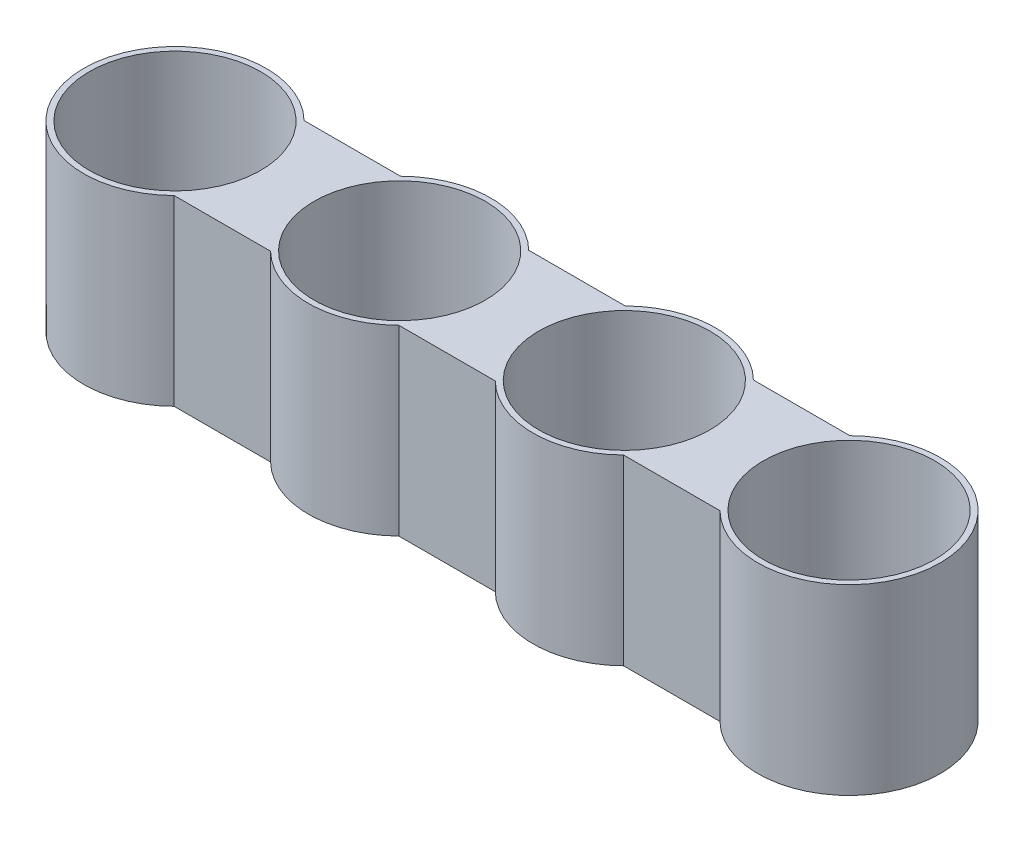
ISO-10303-21;
HEADER;
FILE_DESCRIPTION(('STEP AP214'),'2;1');
FILE_NAME('part.step','',(''),(''),'','','');
FILE_SCHEMA(('AUTOMOTIVE_DESIGN { 1 0 10303 214 1 1 1 1 }'));
ENDSEC;
DATA;
#1=APPLICATION_CONTEXT('core data for automotive mechanical design processes');
#2=APPLICATION_PROTOCOL_DEFINITION('international standard','automotive_design',2000,#1);
#3=PRODUCT_CONTEXT('',#1,'mechanical');
#4=PRODUCT('Part','Part','',(#3));
#5=PRODUCT_RELATED_PRODUCT_CATEGORY('part','',(#4));
#6=PRODUCT_DEFINITION_FORMATION('','',#4);
#7=PRODUCT_DEFINITION_CONTEXT('part definition',#1,'design');
#8=PRODUCT_DEFINITION('design','',#6,#7);
#9=PRODUCT_DEFINITION_SHAPE('','',#8);
#10=(LENGTH_UNIT() NAMED_UNIT(*) SI_UNIT(.MILLI.,.METRE.));
#11=(NAMED_UNIT(*) PLANE_ANGLE_UNIT() SI_UNIT($,.RADIAN.));
#12=(NAMED_UNIT(*) SI_UNIT($,.STERADIAN.) SOLID_ANGLE_UNIT());
#13=UNCERTAINTY_MEASURE_WITH_UNIT(LENGTH_MEASURE(1.E-05),#10,'distance_accuracy_value','');
#14=(GEOMETRIC_REPRESENTATION_CONTEXT(3) GLOBAL_UNCERTAINTY_ASSIGNED_CONTEXT((#13)) GLOBAL_UNIT_ASSIGNED_CONTEXT((#10,
#11,#12)) REPRESENTATION_CONTEXT('',''));
#15=CARTESIAN_POINT('',(0.,0.,0.));
#16=DIRECTION('',(0.,0.,1.));
#17=DIRECTION('',(1.,0.,0.));
#18=AXIS2_PLACEMENT_3D('',#15,#16,#17);
#19=CARTESIAN_POINT('',(40.,10.,5.58637014214901E-13));
#20=DIRECTION('',(0.,1.,0.));
#21=DIRECTION('',(0.,0.,1.));
#22=AXIS2_PLACEMENT_3D('',#19,#20,#21);
#23=PLANE('',#22);
#24=CARTESIAN_POINT('',(40.,10.,5.58637014214901E-13));
#25=DIRECTION('',(0.,-1.,0.));
#26=DIRECTION('',(0.,0.,-1.));
#27=AXIS2_PLACEMENT_3D('',#24,#25,#26);
#28=CIRCLE('',#27,30.5);
#29=CARTESIAN_POINT('',(40.,10.,-30.4999999999994));
#30=VERTEX_POINT('',#29);
#31=EDGE_CURVE('E20',#30,#30,#28,.F.);
#32=ORIENTED_EDGE('',*,*,#31,.T.);
#33=EDGE_LOOP('',(#32));
#34=FACE_BOUND('',#33,.T.);
#35=ADVANCED_FACE('F17',(#34),#23,.T.);
#36=CARTESIAN_POINT('',(-120.,10.,5.58637014214901E-13));
#37=DIRECTION('',(0.,1.,0.));
#38=DIRECTION('',(0.,0.,1.));
#39=AXIS2_PLACEMENT_3D('',#36,#37,#38);
#40=PLANE('',#39);
#41=CARTESIAN_POINT('',(-120.,10.,5.58637014214901E-13));
#42=DIRECTION('',(0.,-1.,0.));
#43=DIRECTION('',(0.,0.,-1.));
#44=AXIS2_PLACEMENT_3D('',#41,#42,#43);
#45=CIRCLE('',#44,30.5);
#46=CARTESIAN_POINT('',(-120.,10.,-30.4999999999994));
#47=VERTEX_POINT('',#46);
#48=EDGE_CURVE('E196',#47,#47,#45,.F.);
#49=ORIENTED_EDGE('',*,*,#48,.T.);
#50=EDGE_LOOP('',(#49));
#51=FACE_BOUND('',#50,.T.);
#52=ADVANCED_FACE('F402',(#51),#40,.T.);
#53=CARTESIAN_POINT('',(-40.,10.,5.58637014214901E-13));
#54=DIRECTION('',(0.,1.,0.));
#55=DIRECTION('',(0.,0.,1.));
#56=AXIS2_PLACEMENT_3D('',#53,#54,#55);
#57=PLANE('',#56);
#58=CARTESIAN_POINT('',(-40.,10.,5.58637014214901E-13));
#59=DIRECTION('',(0.,-1.,0.));
#60=DIRECTION('',(0.,0.,-1.));
#61=AXIS2_PLACEMENT_3D('',#58,#59,#60);
#62=CIRCLE('',#61,30.5);
#63=CARTESIAN_POINT('',(-40.,10.,-30.4999999999994));
#64=VERTEX_POINT('',#63);
#65=EDGE_CURVE('E194',#64,#64,#62,.F.);
#66=ORIENTED_EDGE('',*,*,#65,.T.);
#67=EDGE_LOOP('',(#66));
#68=FACE_BOUND('',#67,.T.);
#69=ADVANCED_FACE('F393',(#68),#57,.T.);
#70=CARTESIAN_POINT('',(120.,10.,5.58637014214901E-13));
#71=DIRECTION('',(0.,1.,0.));
#72=DIRECTION('',(0.,0.,1.));
#73=AXIS2_PLACEMENT_3D('',#70,#71,#72);
#74=PLANE('',#73);
#75=CARTESIAN_POINT('',(120.,10.,5.58637014214901E-13));
#76=DIRECTION('',(0.,-1.,0.));
#77=DIRECTION('',(0.,0.,-1.));
#78=AXIS2_PLACEMENT_3D('',#75,#76,#77);
#79=CIRCLE('',#78,30.5);
#80=CARTESIAN_POINT('',(120.,10.,-30.4999999999994));
#81=VERTEX_POINT('',#80);
#82=EDGE_CURVE('E191',#81,#81,#79,.F.);
#83=ORIENTED_EDGE('',*,*,#82,.T.);
#84=EDGE_LOOP('',(#83));
#85=FACE_BOUND('',#84,.T.);
#86=ADVANCED_FACE('F208',(#85),#74,.T.);
#87=CARTESIAN_POINT('',(40.,72.,5.58637014214901E-13));
#88=DIRECTION('',(0.,-1.,0.));
#89=DIRECTION('',(0.,0.,-1.));
#90=AXIS2_PLACEMENT_3D('',#87,#88,#89);
#91=CYLINDRICAL_SURFACE('',#90,30.5);
#92=ORIENTED_EDGE('',*,*,#31,.F.);
#93=EDGE_LOOP('',(#92));
#94=FACE_BOUND('',#93,.T.);
#95=CARTESIAN_POINT('',(40.,65.,5.58637014214901E-13));
#96=DIRECTION('',(0.,-1.,0.));
#97=DIRECTION('',(0.,0.,-1.));
#98=AXIS2_PLACEMENT_3D('',#95,#96,#97);
#99=CIRCLE('',#98,30.5);
#100=CARTESIAN_POINT('',(40.,65.,-30.4999999999994));
#101=VERTEX_POINT('',#100);
#102=EDGE_CURVE('E188',#101,#101,#99,.T.);
#103=ORIENTED_EDGE('',*,*,#102,.F.);
#104=EDGE_LOOP('',(#103));
#105=FACE_BOUND('',#104,.T.);
#106=ADVANCED_FACE('F204',(#94,#105),#91,.F.);
#107=CARTESIAN_POINT('',(-120.,72.,5.58637014214901E-13));
#108=DIRECTION('',(0.,-1.,0.));
#109=DIRECTION('',(0.,0.,-1.));
#110=AXIS2_PLACEMENT_3D('',#107,#108,#109);
#111=CYLINDRICAL_SURFACE('',#110,30.5);
#112=ORIENTED_EDGE('',*,*,#48,.F.);
#113=EDGE_LOOP('',(#112));
#114=FACE_BOUND('',#113,.T.);
#115=CARTESIAN_POINT('',(-120.,65.,5.58637014214901E-13));
#116=DIRECTION('',(0.,-1.,0.));
#117=DIRECTION('',(0.,0.,-1.));
#118=AXIS2_PLACEMENT_3D('',#115,#116,#117);
#119=CIRCLE('',#118,30.5);
#120=CARTESIAN_POINT('',(-120.,65.,-30.4999999999994));
#121=VERTEX_POINT('',#120);
#122=EDGE_CURVE('E185',#121,#121,#119,.T.);
#123=ORIENTED_EDGE('',*,*,#122,.F.);
#124=EDGE_LOOP('',(#123));
#125=FACE_BOUND('',#124,.T.);
#126=ADVANCED_FACE('F207',(#114,#125),#111,.F.);
#127=CARTESIAN_POINT('',(-40.,72.,5.58637014214901E-13));
#128=DIRECTION('',(0.,-1.,0.));
#129=DIRECTION('',(0.,0.,-1.));
#130=AXIS2_PLACEMENT_3D('',#127,#128,#129);
#131=CYLINDRICAL_SURFACE('',#130,30.5);
#132=ORIENTED_EDGE('',*,*,#65,.F.);
#133=EDGE_LOOP('',(#132));
#134=FACE_BOUND('',#133,.T.);
#135=CARTESIAN_POINT('',(-40.,65.,5.58637014214901E-13));
#136=DIRECTION('',(0.,-1.,0.));
#137=DIRECTION('',(0.,0.,-1.));
#138=AXIS2_PLACEMENT_3D('',#135,#136,#137);
#139=CIRCLE('',#138,30.5);
#140=CARTESIAN_POINT('',(-40.,65.,-30.4999999999994));
#141=VERTEX_POINT('',#140);
#142=EDGE_CURVE('E182',#141,#141,#139,.T.);
#143=ORIENTED_EDGE('',*,*,#142,.F.);
#144=EDGE_LOOP('',(#143));
#145=FACE_BOUND('',#144,.T.);
#146=ADVANCED_FACE('F222',(#134,#145),#131,.F.);
#147=CARTESIAN_POINT('',(120.,72.,5.58637014214901E-13));
#148=DIRECTION('',(0.,-1.,0.));
#149=DIRECTION('',(0.,0.,-1.));
#150=AXIS2_PLACEMENT_3D('',#147,#148,#149);
#151=CYLINDRICAL_SURFACE('',#150,30.5);
#152=ORIENTED_EDGE('',*,*,#82,.F.);
#153=EDGE_LOOP('',(#152));
#154=FACE_BOUND('',#153,.T.);
#155=CARTESIAN_POINT('',(120.,65.,5.58637014214901E-13));
#156=DIRECTION('',(0.,-1.,0.));
#157=DIRECTION('',(0.,0.,-1.));
#158=AXIS2_PLACEMENT_3D('',#155,#156,#157);
#159=CIRCLE('',#158,30.5);
#160=CARTESIAN_POINT('',(120.,65.,-30.4999999999994));
#161=VERTEX_POINT('',#160);
#162=EDGE_CURVE('E124',#161,#161,#159,.T.);
#163=ORIENTED_EDGE('',*,*,#162,.F.);
#164=EDGE_LOOP('',(#163));
#165=FACE_BOUND('',#164,.T.);
#166=ADVANCED_FACE('F213',(#154,#165),#151,.F.);
#167=CARTESIAN_POINT('',(0.,65.,0.));
#168=DIRECTION('',(0.,1.,0.));
#169=DIRECTION('',(0.,0.,1.));
#170=AXIS2_PLACEMENT_3D('',#167,#168,#169);
#171=PLANE('',#170);
#172=ORIENTED_EDGE('',*,*,#162,.T.);
#173=EDGE_LOOP('',(#172));
#174=FACE_BOUND('',#173,.T.);
#175=ORIENTED_EDGE('',*,*,#142,.T.);
#176=EDGE_LOOP('',(#175));
#177=FACE_BOUND('',#176,.T.);
#178=DIRECTION('',(1.,0.,0.));
#179=VECTOR('',#178,1.);
#180=CARTESIAN_POINT('',(0.,65.,-23.1276338785142));
#181=LINE('',#180,#179);
#182=CARTESIAN_POINT('',(17.1666351323025,65.,-23.1276338785142));
#183=VERTEX_POINT('',#182);
#184=CARTESIAN_POINT('',(-17.1666351323025,65.,-23.1276338785142));
#185=VERTEX_POINT('',#184);
#186=EDGE_CURVE('E143',#183,#185,#181,.F.);
#187=ORIENTED_EDGE('',*,*,#186,.T.);
#188=CARTESIAN_POINT('',(-40.,65.,0.));
#189=DIRECTION('',(0.,-1.,0.));
#190=DIRECTION('',(0.,0.,-1.));
#191=AXIS2_PLACEMENT_3D('',#188,#189,#190);
#192=CIRCLE('',#191,32.5);
#193=CARTESIAN_POINT('',(-62.8333648676975,65.,-23.1276338785142));
#194=VERTEX_POINT('',#193);
#195=EDGE_CURVE('E173',#194,#185,#192,.T.);
#196=ORIENTED_EDGE('',*,*,#195,.F.);
#197=DIRECTION('',(1.,0.,0.));
#198=VECTOR('',#197,1.);
#199=CARTESIAN_POINT('',(0.,65.,-23.1276338785142));
#200=LINE('',#199,#198);
#201=CARTESIAN_POINT('',(-97.1666351323031,65.,-23.1276338785142));
#202=VERTEX_POINT('',#201);
#203=EDGE_CURVE('E138',#194,#202,#200,.F.);
#204=ORIENTED_EDGE('',*,*,#203,.T.);
#205=CARTESIAN_POINT('',(-120.,65.,5.58637014214901E-13));
#206=DIRECTION('',(0.,-1.,0.));
#207=DIRECTION('',(0.,0.,-1.));
#208=AXIS2_PLACEMENT_3D('',#205,#206,#207);
#209=CIRCLE('',#208,32.5);
#210=CARTESIAN_POINT('',(-97.1666351323022,65.,23.1276338785144));
#211=VERTEX_POINT('',#210);
#212=EDGE_CURVE('E171',#211,#202,#209,.T.);
#213=ORIENTED_EDGE('',*,*,#212,.F.);
#214=DIRECTION('',(1.,0.,0.));
#215=VECTOR('',#214,1.);
#216=CARTESIAN_POINT('',(0.,65.,23.1276338785143));
#217=LINE('',#216,#215);
#218=CARTESIAN_POINT('',(-62.8333648676973,65.,23.1276338785144));
#219=VERTEX_POINT('',#218);
#220=EDGE_CURVE('E120',#219,#211,#217,.F.);
#221=ORIENTED_EDGE('',*,*,#220,.F.);
#222=CARTESIAN_POINT('',(-40.,65.,0.));
#223=DIRECTION('',(0.,-1.,0.));
#224=DIRECTION('',(0.,0.,-1.));
#225=AXIS2_PLACEMENT_3D('',#222,#223,#224);
#226=CIRCLE('',#225,32.5);
#227=CARTESIAN_POINT('',(-17.1666351323027,65.,23.1276338785144));
#228=VERTEX_POINT('',#227);
#229=EDGE_CURVE('E112',#228,#219,#226,.T.);
#230=ORIENTED_EDGE('',*,*,#229,.F.);
#231=DIRECTION('',(1.,0.,0.));
#232=VECTOR('',#231,1.);
#233=CARTESIAN_POINT('',(0.,65.,23.1276338785144));
#234=LINE('',#233,#232);
#235=CARTESIAN_POINT('',(17.1666351323026,65.,23.1276338785143));
#236=VERTEX_POINT('',#235);
#237=EDGE_CURVE('E102',#236,#228,#234,.F.);
#238=ORIENTED_EDGE('',*,*,#237,.F.);
#239=CARTESIAN_POINT('',(40.,65.,0.));
#240=DIRECTION('',(0.,-1.,0.));
#241=DIRECTION('',(0.,0.,-1.));
#242=AXIS2_PLACEMENT_3D('',#239,#240,#241);
#243=CIRCLE('',#242,32.5);
#244=CARTESIAN_POINT('',(62.8333648676974,65.,23.1276338785143));
#245=VERTEX_POINT('',#244);
#246=EDGE_CURVE('E129',#245,#236,#243,.T.);
#247=ORIENTED_EDGE('',*,*,#246,.F.);
#248=DIRECTION('',(1.,0.,0.));
#249=VECTOR('',#248,1.);
#250=CARTESIAN_POINT('',(0.,65.,23.1276338785144));
#251=LINE('',#250,#249);
#252=CARTESIAN_POINT('',(97.166635132302,65.,23.1276338785143));
#253=VERTEX_POINT('',#252);
#254=EDGE_CURVE('E152',#253,#245,#251,.F.);
#255=ORIENTED_EDGE('',*,*,#254,.F.);
#256=CARTESIAN_POINT('',(120.,65.,5.58637014214901E-13));
#257=DIRECTION('',(0.,-1.,0.));
#258=DIRECTION('',(0.,0.,-1.));
#259=AXIS2_PLACEMENT_3D('',#256,#257,#258);
#260=CIRCLE('',#259,32.5);
#261=CARTESIAN_POINT('',(97.1666351323031,65.,-23.1276338785142));
#262=VERTEX_POINT('',#261);
#263=EDGE_CURVE('E177',#262,#253,#260,.T.);
#264=ORIENTED_EDGE('',*,*,#263,.F.);
#265=DIRECTION('',(1.,0.,0.));
#266=VECTOR('',#265,1.);
#267=CARTESIAN_POINT('',(0.,65.,-23.1276338785143));
#268=LINE('',#267,#266);
#269=CARTESIAN_POINT('',(62.8333648676975,65.,-23.1276338785142));
#270=VERTEX_POINT('',#269);
#271=EDGE_CURVE('E147',#262,#270,#268,.F.);
#272=ORIENTED_EDGE('',*,*,#271,.T.);
#273=CARTESIAN_POINT('',(40.,65.,0.));
#274=DIRECTION('',(0.,-1.,0.));
#275=DIRECTION('',(0.,0.,-1.));
#276=AXIS2_PLACEMENT_3D('',#273,#274,#275);
#277=CIRCLE('',#276,32.5);
#278=EDGE_CURVE('E175',#183,#270,#277,.T.);
#279=ORIENTED_EDGE('',*,*,#278,.F.);
#280=EDGE_LOOP('',(#187,#196,#204,#213,#221,#230,#238,#247,#255,#264,#272,#279));
#281=FACE_BOUND('',#280,.T.);
#282=ORIENTED_EDGE('',*,*,#122,.T.);
#283=EDGE_LOOP('',(#282));
#284=FACE_BOUND('',#283,.T.);
#285=ORIENTED_EDGE('',*,*,#102,.T.);
#286=EDGE_LOOP('',(#285));
#287=FACE_BOUND('',#286,.T.);
#288=ADVANCED_FACE('F117',(#174,#177,#281,#284,#287),#171,.T.);
#289=CARTESIAN_POINT('',(-40.,65.,0.));
#290=DIRECTION('',(0.,-1.,0.));
#291=DIRECTION('',(0.,0.,-1.));
#292=AXIS2_PLACEMENT_3D('',#289,#290,#291);
#293=CYLINDRICAL_SURFACE('',#292,32.5);
#294=ORIENTED_EDGE('',*,*,#229,.T.);
#295=DIRECTION('',(0.,1.,0.));
#296=VECTOR('',#295,1.);
#297=CARTESIAN_POINT('',(-62.8333648676973,65.,23.1276338785144));
#298=LINE('',#297,#296);
#299=CARTESIAN_POINT('',(-62.8333648676973,0.,23.1276338785144));
#300=VERTEX_POINT('',#299);
#301=EDGE_CURVE('E137',#300,#219,#298,.T.);
#302=ORIENTED_EDGE('',*,*,#301,.F.);
#303=CARTESIAN_POINT('',(-40.,0.,0.));
#304=DIRECTION('',(0.,-1.,0.));
#305=DIRECTION('',(0.,0.,-1.));
#306=AXIS2_PLACEMENT_3D('',#303,#304,#305);
#307=CIRCLE('',#306,32.5);
#308=CARTESIAN_POINT('',(-17.1666351323027,0.,23.1276338785144));
#309=VERTEX_POINT('',#308);
#310=EDGE_CURVE('E128',#300,#309,#307,.F.);
#311=ORIENTED_EDGE('',*,*,#310,.T.);
#312=DIRECTION('',(0.,1.,0.));
#313=VECTOR('',#312,1.);
#314=CARTESIAN_POINT('',(-17.1666351323027,65.,23.1276338785144));
#315=LINE('',#314,#313);
#316=EDGE_CURVE('E107',#228,#309,#315,.F.);
#317=ORIENTED_EDGE('',*,*,#316,.F.);
#318=EDGE_LOOP('',(#294,#302,#311,#317));
#319=FACE_BOUND('',#318,.T.);
#320=ADVANCED_FACE('F127',(#319),#293,.T.);
#321=CARTESIAN_POINT('',(0.,65.,23.1276338785144));
#322=DIRECTION('',(0.,0.,1.));
#323=DIRECTION('',(1.,0.,0.));
#324=AXIS2_PLACEMENT_3D('',#321,#322,#323);
#325=PLANE('',#324);
#326=ORIENTED_EDGE('',*,*,#237,.T.);
#327=ORIENTED_EDGE('',*,*,#316,.T.);
#328=DIRECTION('',(1.,0.,0.));
#329=VECTOR('',#328,1.);
#330=CARTESIAN_POINT('',(0.,0.,23.1276338785144));
#331=LINE('',#330,#329);
#332=CARTESIAN_POINT('',(17.1666351323027,0.,23.1276338785144));
#333=VERTEX_POINT('',#332);
#334=EDGE_CURVE('E169',#309,#333,#331,.T.);
#335=ORIENTED_EDGE('',*,*,#334,.T.);
#336=DIRECTION('',(0.,-1.,0.));
#337=VECTOR('',#336,1.);
#338=CARTESIAN_POINT('',(17.1666351323026,65.,23.1276338785143));
#339=LINE('',#338,#337);
#340=EDGE_CURVE('E109',#236,#333,#339,.T.);
#341=ORIENTED_EDGE('',*,*,#340,.F.);
#342=EDGE_LOOP('',(#326,#327,#335,#341));
#343=FACE_BOUND('',#342,.T.);
#344=ADVANCED_FACE('F104',(#343),#325,.T.);
#345=CARTESIAN_POINT('',(40.,65.,0.));
#346=DIRECTION('',(0.,-1.,0.));
#347=DIRECTION('',(0.,0.,-1.));
#348=AXIS2_PLACEMENT_3D('',#345,#346,#347);
#349=CYLINDRICAL_SURFACE('',#348,32.5);
#350=ORIENTED_EDGE('',*,*,#246,.T.);
#351=ORIENTED_EDGE('',*,*,#340,.T.);
#352=CARTESIAN_POINT('',(40.,0.,0.));
#353=DIRECTION('',(0.,-1.,0.));
#354=DIRECTION('',(0.,0.,-1.));
#355=AXIS2_PLACEMENT_3D('',#352,#353,#354);
#356=CIRCLE('',#355,32.5);
#357=CARTESIAN_POINT('',(62.8333648676974,0.,23.1276338785143));
#358=VERTEX_POINT('',#357);
#359=EDGE_CURVE('E166',#333,#358,#356,.F.);
#360=ORIENTED_EDGE('',*,*,#359,.T.);
#361=DIRECTION('',(0.,1.,0.));
#362=VECTOR('',#361,1.);
#363=CARTESIAN_POINT('',(62.8333648676974,65.,23.1276338785143));
#364=LINE('',#363,#362);
#365=EDGE_CURVE('E153',#245,#358,#364,.F.);
#366=ORIENTED_EDGE('',*,*,#365,.F.);
#367=EDGE_LOOP('',(#350,#351,#360,#366));
#368=FACE_BOUND('',#367,.T.);
#369=ADVANCED_FACE('F268',(#368),#349,.T.);
#370=CARTESIAN_POINT('',(0.,65.,23.1276338785144));
#371=DIRECTION('',(0.,0.,1.));
#372=DIRECTION('',(1.,0.,0.));
#373=AXIS2_PLACEMENT_3D('',#370,#371,#372);
#374=PLANE('',#373);
#375=ORIENTED_EDGE('',*,*,#254,.T.);
#376=ORIENTED_EDGE('',*,*,#365,.T.);
#377=DIRECTION('',(1.,0.,0.));
#378=VECTOR('',#377,1.);
#379=CARTESIAN_POINT('',(0.,0.,23.1276338785143));
#380=LINE('',#379,#378);
#381=CARTESIAN_POINT('',(97.166635132302,0.,23.1276338785143));
#382=VERTEX_POINT('',#381);
#383=EDGE_CURVE('E165',#358,#382,#380,.T.);
#384=ORIENTED_EDGE('',*,*,#383,.T.);
#385=DIRECTION('',(0.,-1.,0.));
#386=VECTOR('',#385,1.);
#387=CARTESIAN_POINT('',(97.166635132302,65.,23.1276338785143));
#388=LINE('',#387,#386);
#389=EDGE_CURVE('E178',#253,#382,#388,.T.);
#390=ORIENTED_EDGE('',*,*,#389,.F.);
#391=EDGE_LOOP('',(#375,#376,#384,#390));
#392=FACE_BOUND('',#391,.T.);
#393=ADVANCED_FACE('F264',(#392),#374,.T.);
#394=CARTESIAN_POINT('',(120.,65.,5.58637014214901E-13));
#395=DIRECTION('',(0.,-1.,0.));
#396=DIRECTION('',(0.,0.,-1.));
#397=AXIS2_PLACEMENT_3D('',#394,#395,#396);
#398=CYLINDRICAL_SURFACE('',#397,32.5);
#399=CARTESIAN_POINT('',(120.,0.,5.58637014214901E-13));
#400=DIRECTION('',(0.,-1.,0.));
#401=DIRECTION('',(0.,0.,-1.));
#402=AXIS2_PLACEMENT_3D('',#399,#400,#401);
#403=CIRCLE('',#402,32.5);
#404=CARTESIAN_POINT('',(97.1666351323031,0.,-23.1276338785142));
#405=VERTEX_POINT('',#404);
#406=EDGE_CURVE('E163',#382,#405,#403,.F.);
#407=ORIENTED_EDGE('',*,*,#406,.T.);
#408=DIRECTION('',(0.,1.,0.));
#409=VECTOR('',#408,1.);
#410=CARTESIAN_POINT('',(97.1666351323031,65.,-23.1276338785142));
#411=LINE('',#410,#409);
#412=EDGE_CURVE('E151',#405,#262,#411,.T.);
#413=ORIENTED_EDGE('',*,*,#412,.T.);
#414=ORIENTED_EDGE('',*,*,#263,.T.);
#415=ORIENTED_EDGE('',*,*,#389,.T.);
#416=EDGE_LOOP('',(#407,#413,#414,#415));
#417=FACE_BOUND('',#416,.T.);
#418=ADVANCED_FACE('F260',(#417),#398,.T.);
#419=CARTESIAN_POINT('',(0.,65.,-23.1276338785143));
#420=DIRECTION('',(0.,0.,1.));
#421=DIRECTION('',(1.,0.,0.));
#422=AXIS2_PLACEMENT_3D('',#419,#420,#421);
#423=PLANE('',#422);
#424=DIRECTION('',(0.,-1.,0.));
#425=VECTOR('',#424,1.);
#426=CARTESIAN_POINT('',(62.8333648676975,65.,-23.1276338785142));
#427=LINE('',#426,#425);
#428=CARTESIAN_POINT('',(62.8333648676975,0.,-23.1276338785142));
#429=VERTEX_POINT('',#428);
#430=EDGE_CURVE('E150',#270,#429,#427,.T.);
#431=ORIENTED_EDGE('',*,*,#430,.F.);
#432=ORIENTED_EDGE('',*,*,#271,.F.);
#433=ORIENTED_EDGE('',*,*,#412,.F.);
#434=DIRECTION('',(1.,0.,0.));
#435=VECTOR('',#434,1.);
#436=CARTESIAN_POINT('',(0.,0.,-23.1276338785142));
#437=LINE('',#436,#435);
#438=EDGE_CURVE('E162',#405,#429,#437,.F.);
#439=ORIENTED_EDGE('',*,*,#438,.T.);
#440=EDGE_LOOP('',(#431,#432,#433,#439));
#441=FACE_BOUND('',#440,.T.);
#442=ADVANCED_FACE('F256',(#441),#423,.F.);
#443=CARTESIAN_POINT('',(40.,65.,0.));
#444=DIRECTION('',(0.,-1.,0.));
#445=DIRECTION('',(0.,0.,-1.));
#446=AXIS2_PLACEMENT_3D('',#443,#444,#445);
#447=CYLINDRICAL_SURFACE('',#446,32.5);
#448=CARTESIAN_POINT('',(40.,0.,0.));
#449=DIRECTION('',(0.,-1.,0.));
#450=DIRECTION('',(0.,0.,-1.));
#451=AXIS2_PLACEMENT_3D('',#448,#449,#450);
#452=CIRCLE('',#451,32.5);
#453=CARTESIAN_POINT('',(17.1666351323025,0.,-23.1276338785142));
#454=VERTEX_POINT('',#453);
#455=EDGE_CURVE('E160',#429,#454,#452,.F.);
#456=ORIENTED_EDGE('',*,*,#455,.T.);
#457=DIRECTION('',(0.,1.,0.));
#458=VECTOR('',#457,1.);
#459=CARTESIAN_POINT('',(17.1666351323025,65.,-23.1276338785142));
#460=LINE('',#459,#458);
#461=EDGE_CURVE('E146',#454,#183,#460,.T.);
#462=ORIENTED_EDGE('',*,*,#461,.T.);
#463=ORIENTED_EDGE('',*,*,#278,.T.);
#464=ORIENTED_EDGE('',*,*,#430,.T.);
#465=EDGE_LOOP('',(#456,#462,#463,#464));
#466=FACE_BOUND('',#465,.T.);
#467=ADVANCED_FACE('F252',(#466),#447,.T.);
#468=CARTESIAN_POINT('',(0.,65.,-23.1276338785142));
#469=DIRECTION('',(0.,0.,1.));
#470=DIRECTION('',(1.,0.,0.));
#471=AXIS2_PLACEMENT_3D('',#468,#469,#470);
#472=PLANE('',#471);
#473=DIRECTION('',(0.,-1.,0.));
#474=VECTOR('',#473,1.);
#475=CARTESIAN_POINT('',(-17.1666351323025,65.,-23.1276338785142));
#476=LINE('',#475,#474);
#477=CARTESIAN_POINT('',(-17.1666351323025,0.,-23.1276338785142));
#478=VERTEX_POINT('',#477);
#479=EDGE_CURVE('E145',#185,#478,#476,.T.);
#480=ORIENTED_EDGE('',*,*,#479,.F.);
#481=ORIENTED_EDGE('',*,*,#186,.F.);
#482=ORIENTED_EDGE('',*,*,#461,.F.);
#483=DIRECTION('',(1.,0.,0.));
#484=VECTOR('',#483,1.);
#485=CARTESIAN_POINT('',(0.,0.,-23.1276338785142));
#486=LINE('',#485,#484);
#487=EDGE_CURVE('E159',#454,#478,#486,.F.);
#488=ORIENTED_EDGE('',*,*,#487,.T.);
#489=EDGE_LOOP('',(#480,#481,#482,#488));
#490=FACE_BOUND('',#489,.T.);
#491=ADVANCED_FACE('F248',(#490),#472,.F.);
#492=CARTESIAN_POINT('',(-40.,65.,0.));
#493=DIRECTION('',(0.,-1.,0.));
#494=DIRECTION('',(0.,0.,-1.));
#495=AXIS2_PLACEMENT_3D('',#492,#493,#494);
#496=CYLINDRICAL_SURFACE('',#495,32.5);
#497=CARTESIAN_POINT('',(-40.,0.,0.));
#498=DIRECTION('',(0.,-1.,0.));
#499=DIRECTION('',(0.,0.,-1.));
#500=AXIS2_PLACEMENT_3D('',#497,#498,#499);
#501=CIRCLE('',#500,32.5);
#502=CARTESIAN_POINT('',(-62.8333648676975,0.,-23.1276338785142));
#503=VERTEX_POINT('',#502);
#504=EDGE_CURVE('E157',#478,#503,#501,.F.);
#505=ORIENTED_EDGE('',*,*,#504,.T.);
#506=DIRECTION('',(0.,1.,0.));
#507=VECTOR('',#506,1.);
#508=CARTESIAN_POINT('',(-62.8333648676975,65.,-23.1276338785142));
#509=LINE('',#508,#507);
#510=EDGE_CURVE('E142',#503,#194,#509,.T.);
#511=ORIENTED_EDGE('',*,*,#510,.T.);
#512=ORIENTED_EDGE('',*,*,#195,.T.);
#513=ORIENTED_EDGE('',*,*,#479,.T.);
#514=EDGE_LOOP('',(#505,#511,#512,#513));
#515=FACE_BOUND('',#514,.T.);
#516=ADVANCED_FACE('F244',(#515),#496,.T.);
#517=CARTESIAN_POINT('',(0.,65.,-23.1276338785142));
#518=DIRECTION('',(0.,0.,1.));
#519=DIRECTION('',(1.,0.,0.));
#520=AXIS2_PLACEMENT_3D('',#517,#518,#519);
#521=PLANE('',#520);
#522=DIRECTION('',(0.,-1.,0.));
#523=VECTOR('',#522,1.);
#524=CARTESIAN_POINT('',(-97.1666351323031,65.,-23.1276338785142));
#525=LINE('',#524,#523);
#526=CARTESIAN_POINT('',(-97.1666351323031,0.,-23.1276338785142));
#527=VERTEX_POINT('',#526);
#528=EDGE_CURVE('E141',#202,#527,#525,.T.);
#529=ORIENTED_EDGE('',*,*,#528,.F.);
#530=ORIENTED_EDGE('',*,*,#203,.F.);
#531=ORIENTED_EDGE('',*,*,#510,.F.);
#532=DIRECTION('',(1.,0.,0.));
#533=VECTOR('',#532,1.);
#534=CARTESIAN_POINT('',(0.,0.,-23.1276338785142));
#535=LINE('',#534,#533);
#536=EDGE_CURVE('E156',#503,#527,#535,.F.);
#537=ORIENTED_EDGE('',*,*,#536,.T.);
#538=EDGE_LOOP('',(#529,#530,#531,#537));
#539=FACE_BOUND('',#538,.T.);
#540=ADVANCED_FACE('F241',(#539),#521,.F.);
#541=CARTESIAN_POINT('',(-120.,65.,5.58637014214901E-13));
#542=DIRECTION('',(0.,-1.,0.));
#543=DIRECTION('',(0.,0.,-1.));
#544=AXIS2_PLACEMENT_3D('',#541,#542,#543);
#545=CYLINDRICAL_SURFACE('',#544,32.5);
#546=CARTESIAN_POINT('',(-120.,0.,5.58637014214901E-13));
#547=DIRECTION('',(0.,-1.,0.));
#548=DIRECTION('',(0.,0.,-1.));
#549=AXIS2_PLACEMENT_3D('',#546,#547,#548);
#550=CIRCLE('',#549,32.5);
#551=CARTESIAN_POINT('',(-97.1666351323022,0.,23.1276338785144));
#552=VERTEX_POINT('',#551);
#553=EDGE_CURVE('E26',#527,#552,#550,.F.);
#554=ORIENTED_EDGE('',*,*,#553,.T.);
#555=DIRECTION('',(0.,1.,0.));
#556=VECTOR('',#555,1.);
#557=CARTESIAN_POINT('',(-97.1666351323022,65.,23.1276338785144));
#558=LINE('',#557,#556);
#559=EDGE_CURVE('E136',#211,#552,#558,.F.);
#560=ORIENTED_EDGE('',*,*,#559,.F.);
#561=ORIENTED_EDGE('',*,*,#212,.T.);
#562=ORIENTED_EDGE('',*,*,#528,.T.);
#563=EDGE_LOOP('',(#554,#560,#561,#562));
#564=FACE_BOUND('',#563,.T.);
#565=ADVANCED_FACE('F234',(#564),#545,.T.);
#566=CARTESIAN_POINT('',(0.,65.,23.1276338785143));
#567=DIRECTION('',(0.,0.,1.));
#568=DIRECTION('',(1.,0.,0.));
#569=AXIS2_PLACEMENT_3D('',#566,#567,#568);
#570=PLANE('',#569);
#571=ORIENTED_EDGE('',*,*,#220,.T.);
#572=ORIENTED_EDGE('',*,*,#559,.T.);
#573=DIRECTION('',(1.,0.,0.));
#574=VECTOR('',#573,1.);
#575=CARTESIAN_POINT('',(0.,0.,23.1276338785144));
#576=LINE('',#575,#574);
#577=EDGE_CURVE('E11',#552,#300,#576,.T.);
#578=ORIENTED_EDGE('',*,*,#577,.T.);
#579=ORIENTED_EDGE('',*,*,#301,.T.);
#580=EDGE_LOOP('',(#571,#572,#578,#579));
#581=FACE_BOUND('',#580,.T.);
#582=ADVANCED_FACE('F228',(#581),#570,.T.);
#583=CARTESIAN_POINT('',(0.,0.,0.));
#584=DIRECTION('',(0.,1.,0.));
#585=DIRECTION('',(0.,0.,1.));
#586=AXIS2_PLACEMENT_3D('',#583,#584,#585);
#587=PLANE('',#586);
#588=ORIENTED_EDGE('',*,*,#577,.F.);
#589=ORIENTED_EDGE('',*,*,#553,.F.);
#590=ORIENTED_EDGE('',*,*,#536,.F.);
#591=ORIENTED_EDGE('',*,*,#504,.F.);
#592=ORIENTED_EDGE('',*,*,#487,.F.);
#593=ORIENTED_EDGE('',*,*,#455,.F.);
#594=ORIENTED_EDGE('',*,*,#438,.F.);
#595=ORIENTED_EDGE('',*,*,#406,.F.);
#596=ORIENTED_EDGE('',*,*,#383,.F.);
#597=ORIENTED_EDGE('',*,*,#359,.F.);
#598=ORIENTED_EDGE('',*,*,#334,.F.);
#599=ORIENTED_EDGE('',*,*,#310,.F.);
#600=EDGE_LOOP('',(#588,#589,#590,#591,#592,#593,#594,#595,#596,#597,#598,#599));
#601=FACE_BOUND('',#600,.T.);
#602=ADVANCED_FACE('F226',(#601),#587,.F.);
#603=CLOSED_SHELL('',(#35,#52,#69,#86,#106,#126,#146,#166,#288,#320,#344,#369,#393,#418,#442,
#467,#491,#516,#540,#565,#582,#602));
#604=MANIFOLD_SOLID_BREP('B1',#603);
#605=ADVANCED_BREP_SHAPE_REPRESENTATION('',(#18,#604),#14);
#606=SHAPE_DEFINITION_REPRESENTATION(#9,#605);
ENDSEC;
END-ISO-10303-21;
